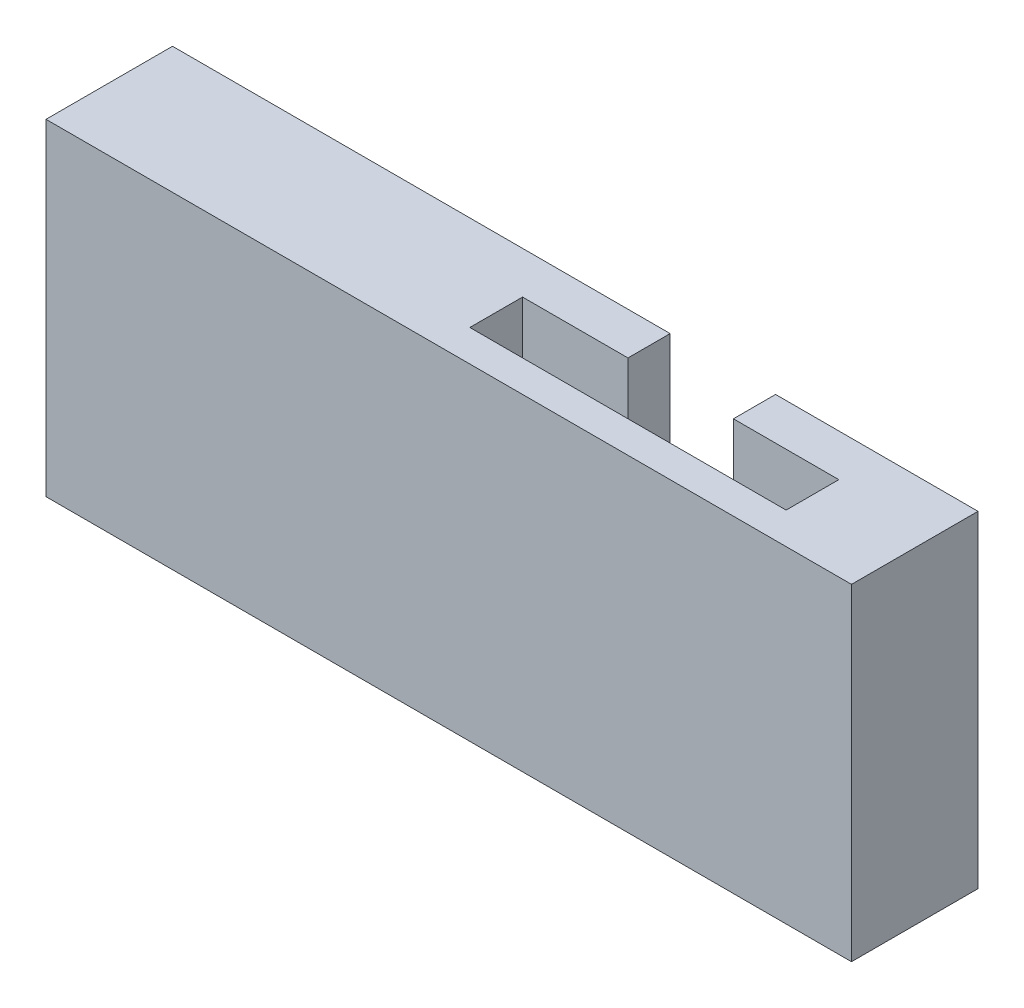
ISO-10303-21;
HEADER;
FILE_DESCRIPTION(('STEP AP214'),'2;1');
FILE_NAME('part.step','',(''),(''),'','','');
FILE_SCHEMA(('AUTOMOTIVE_DESIGN { 1 0 10303 214 1 1 1 1 }'));
ENDSEC;
DATA;
#1=APPLICATION_CONTEXT('core data for automotive mechanical design processes');
#2=APPLICATION_PROTOCOL_DEFINITION('international standard','automotive_design',2000,#1);
#3=PRODUCT_CONTEXT('',#1,'mechanical');
#4=PRODUCT('Part','Part','',(#3));
#5=PRODUCT_RELATED_PRODUCT_CATEGORY('part','',(#4));
#6=PRODUCT_DEFINITION_FORMATION('','',#4);
#7=PRODUCT_DEFINITION_CONTEXT('part definition',#1,'design');
#8=PRODUCT_DEFINITION('design','',#6,#7);
#9=PRODUCT_DEFINITION_SHAPE('','',#8);
#10=(LENGTH_UNIT() NAMED_UNIT(*) SI_UNIT(.MILLI.,.METRE.));
#11=(NAMED_UNIT(*) PLANE_ANGLE_UNIT() SI_UNIT($,.RADIAN.));
#12=(NAMED_UNIT(*) SI_UNIT($,.STERADIAN.) SOLID_ANGLE_UNIT());
#13=UNCERTAINTY_MEASURE_WITH_UNIT(LENGTH_MEASURE(1.E-05),#10,'distance_accuracy_value','');
#14=(GEOMETRIC_REPRESENTATION_CONTEXT(3) GLOBAL_UNCERTAINTY_ASSIGNED_CONTEXT((#13)) GLOBAL_UNIT_ASSIGNED_CONTEXT((#10,
#11,#12)) REPRESENTATION_CONTEXT('',''));
#15=CARTESIAN_POINT('',(0.,0.,0.));
#16=DIRECTION('',(0.,0.,1.));
#17=DIRECTION('',(1.,0.,0.));
#18=AXIS2_PLACEMENT_3D('',#15,#16,#17);
#19=CARTESIAN_POINT('',(0.,15.5,-6.));
#20=DIRECTION('',(0.,1.,0.));
#21=DIRECTION('',(0.,0.,-1.));
#22=AXIS2_PLACEMENT_3D('',#19,#20,#21);
#23=PLANE('',#22);
#24=DIRECTION('',(-1.,0.,0.));
#25=VECTOR('',#24,1.);
#26=CARTESIAN_POINT('',(0.,15.5,-6.));
#27=LINE('',#26,#25);
#28=CARTESIAN_POINT('',(38.6,15.5,-6.));
#29=VERTEX_POINT('',#28);
#30=CARTESIAN_POINT('',(0.4,15.5,-6.));
#31=VERTEX_POINT('',#30);
#32=EDGE_CURVE('E153',#29,#31,#27,.T.);
#33=ORIENTED_EDGE('',*,*,#32,.F.);
#34=DIRECTION('',(0.,0.,1.));
#35=VECTOR('',#34,1.);
#36=CARTESIAN_POINT('',(38.6,15.5,-6.));
#37=LINE('',#36,#35);
#38=CARTESIAN_POINT('',(38.6,15.5,-12.));
#39=VERTEX_POINT('',#38);
#40=EDGE_CURVE('E216',#39,#29,#37,.T.);
#41=ORIENTED_EDGE('',*,*,#40,.F.);
#42=DIRECTION('',(-1.,0.,0.));
#43=VECTOR('',#42,1.);
#44=CARTESIAN_POINT('',(0.,15.5,-12.));
#45=LINE('',#44,#43);
#46=CARTESIAN_POINT('',(29.,15.5,-12.));
#47=VERTEX_POINT('',#46);
#48=EDGE_CURVE('E146',#39,#47,#45,.T.);
#49=ORIENTED_EDGE('',*,*,#48,.T.);
#50=DIRECTION('',(0.,0.,1.));
#51=VECTOR('',#50,1.);
#52=CARTESIAN_POINT('',(29.,15.5,-10.));
#53=LINE('',#52,#51);
#54=CARTESIAN_POINT('',(29.,15.5,-10.));
#55=VERTEX_POINT('',#54);
#56=EDGE_CURVE('E196',#47,#55,#53,.T.);
#57=ORIENTED_EDGE('',*,*,#56,.T.);
#58=DIRECTION('',(1.,0.,0.));
#59=VECTOR('',#58,1.);
#60=CARTESIAN_POINT('',(34.,15.5,-10.));
#61=LINE('',#60,#59);
#62=CARTESIAN_POINT('',(34.,15.5,-10.));
#63=VERTEX_POINT('',#62);
#64=EDGE_CURVE('E199',#55,#63,#61,.T.);
#65=ORIENTED_EDGE('',*,*,#64,.T.);
#66=DIRECTION('',(0.,0.,1.));
#67=VECTOR('',#66,1.);
#68=CARTESIAN_POINT('',(34.,15.5,-7.5));
#69=LINE('',#68,#67);
#70=CARTESIAN_POINT('',(34.,15.5,-7.5));
#71=VERTEX_POINT('',#70);
#72=EDGE_CURVE('E203',#63,#71,#69,.T.);
#73=ORIENTED_EDGE('',*,*,#72,.T.);
#74=DIRECTION('',(-1.,0.,0.));
#75=VECTOR('',#74,1.);
#76=CARTESIAN_POINT('',(19.,15.5,-7.5));
#77=LINE('',#76,#75);
#78=CARTESIAN_POINT('',(19.,15.5,-7.5));
#79=VERTEX_POINT('',#78);
#80=EDGE_CURVE('E206',#71,#79,#77,.T.);
#81=ORIENTED_EDGE('',*,*,#80,.T.);
#82=DIRECTION('',(0.,0.,-1.));
#83=VECTOR('',#82,1.);
#84=CARTESIAN_POINT('',(19.,15.5,-10.));
#85=LINE('',#84,#83);
#86=CARTESIAN_POINT('',(19.,15.5,-10.));
#87=VERTEX_POINT('',#86);
#88=EDGE_CURVE('E209',#79,#87,#85,.T.);
#89=ORIENTED_EDGE('',*,*,#88,.T.);
#90=DIRECTION('',(1.,0.,0.));
#91=VECTOR('',#90,1.);
#92=CARTESIAN_POINT('',(24.,15.5,-10.));
#93=LINE('',#92,#91);
#94=CARTESIAN_POINT('',(24.,15.5,-10.));
#95=VERTEX_POINT('',#94);
#96=EDGE_CURVE('E212',#87,#95,#93,.T.);
#97=ORIENTED_EDGE('',*,*,#96,.T.);
#98=DIRECTION('',(0.,0.,-1.));
#99=VECTOR('',#98,1.);
#100=CARTESIAN_POINT('',(24.,15.5,-12.));
#101=LINE('',#100,#99);
#102=CARTESIAN_POINT('',(24.,15.5,-12.));
#103=VERTEX_POINT('',#102);
#104=EDGE_CURVE('E145',#95,#103,#101,.T.);
#105=ORIENTED_EDGE('',*,*,#104,.T.);
#106=CARTESIAN_POINT('',(0.4,15.5,-12.));
#107=VERTEX_POINT('',#106);
#108=EDGE_CURVE('E130',#103,#107,#45,.T.);
#109=ORIENTED_EDGE('',*,*,#108,.T.);
#110=DIRECTION('',(0.,0.,-1.));
#111=VECTOR('',#110,1.);
#112=CARTESIAN_POINT('',(0.4,15.5,-6.));
#113=LINE('',#112,#111);
#114=EDGE_CURVE('E135',#31,#107,#113,.T.);
#115=ORIENTED_EDGE('',*,*,#114,.F.);
#116=EDGE_LOOP('',(#33,#41,#49,#57,#65,#73,#81,#89,#97,#105,#109,#115));
#117=FACE_BOUND('',#116,.T.);
#118=ADVANCED_FACE('F39',(#117),#23,.T.);
#119=CARTESIAN_POINT('',(0.,0.,-6.));
#120=DIRECTION('',(0.,-1.,0.));
#121=DIRECTION('',(0.,0.,1.));
#122=AXIS2_PLACEMENT_3D('',#119,#120,#121);
#123=PLANE('',#122);
#124=DIRECTION('',(1.,0.,0.));
#125=VECTOR('',#124,1.);
#126=CARTESIAN_POINT('',(0.,0.,-12.));
#127=LINE('',#126,#125);
#128=CARTESIAN_POINT('',(0.4,0.,-12.));
#129=VERTEX_POINT('',#128);
#130=CARTESIAN_POINT('',(38.6,0.,-12.));
#131=VERTEX_POINT('',#130);
#132=EDGE_CURVE('E133',#129,#131,#127,.T.);
#133=ORIENTED_EDGE('',*,*,#132,.T.);
#134=DIRECTION('',(0.,0.,-1.));
#135=VECTOR('',#134,1.);
#136=CARTESIAN_POINT('',(38.6,0.,-6.));
#137=LINE('',#136,#135);
#138=CARTESIAN_POINT('',(38.6,0.,-6.));
#139=VERTEX_POINT('',#138);
#140=EDGE_CURVE('E218',#139,#131,#137,.T.);
#141=ORIENTED_EDGE('',*,*,#140,.F.);
#142=DIRECTION('',(1.,0.,0.));
#143=VECTOR('',#142,1.);
#144=CARTESIAN_POINT('',(0.,0.,-6.));
#145=LINE('',#144,#143);
#146=CARTESIAN_POINT('',(0.4,0.,-6.));
#147=VERTEX_POINT('',#146);
#148=EDGE_CURVE('E149',#147,#139,#145,.T.);
#149=ORIENTED_EDGE('',*,*,#148,.F.);
#150=DIRECTION('',(0.,0.,1.));
#151=VECTOR('',#150,1.);
#152=CARTESIAN_POINT('',(0.4,0.,-6.));
#153=LINE('',#152,#151);
#154=EDGE_CURVE('E141',#129,#147,#153,.T.);
#155=ORIENTED_EDGE('',*,*,#154,.F.);
#156=EDGE_LOOP('',(#133,#141,#149,#155));
#157=FACE_BOUND('',#156,.T.);
#158=ADVANCED_FACE('F41',(#157),#123,.T.);
#159=CARTESIAN_POINT('',(0.,0.,-6.));
#160=DIRECTION('',(0.,0.,1.));
#161=DIRECTION('',(-1.,0.,0.));
#162=AXIS2_PLACEMENT_3D('',#159,#160,#161);
#163=PLANE('',#162);
#164=ORIENTED_EDGE('',*,*,#148,.T.);
#165=DIRECTION('',(0.,-1.,0.));
#166=VECTOR('',#165,1.);
#167=CARTESIAN_POINT('',(38.6,0.,-6.));
#168=LINE('',#167,#166);
#169=EDGE_CURVE('E200',#29,#139,#168,.T.);
#170=ORIENTED_EDGE('',*,*,#169,.F.);
#171=ORIENTED_EDGE('',*,*,#32,.T.);
#172=DIRECTION('',(0.,1.,0.));
#173=VECTOR('',#172,1.);
#174=CARTESIAN_POINT('',(0.4,0.,-6.));
#175=LINE('',#174,#173);
#176=EDGE_CURVE('E137',#147,#31,#175,.T.);
#177=ORIENTED_EDGE('',*,*,#176,.F.);
#178=EDGE_LOOP('',(#164,#170,#171,#177));
#179=FACE_BOUND('',#178,.T.);
#180=ADVANCED_FACE('F224',(#179),#163,.T.);
#181=CARTESIAN_POINT('',(0.,0.,-12.));
#182=DIRECTION('',(0.,0.,1.));
#183=DIRECTION('',(-1.,0.,0.));
#184=AXIS2_PLACEMENT_3D('',#181,#182,#183);
#185=PLANE('',#184);
#186=DIRECTION('',(0.,1.,0.));
#187=VECTOR('',#186,1.);
#188=CARTESIAN_POINT('',(0.4,0.,-12.));
#189=LINE('',#188,#187);
#190=EDGE_CURVE('E12',#129,#107,#189,.T.);
#191=ORIENTED_EDGE('',*,*,#190,.T.);
#192=ORIENTED_EDGE('',*,*,#108,.F.);
#193=DIRECTION('',(0.,1.,0.));
#194=VECTOR('',#193,1.);
#195=CARTESIAN_POINT('',(24.,-15.6604597633658,-12.));
#196=LINE('',#195,#194);
#197=CARTESIAN_POINT('',(24.,3.,-12.));
#198=VERTEX_POINT('',#197);
#199=EDGE_CURVE('E179',#198,#103,#196,.T.);
#200=ORIENTED_EDGE('',*,*,#199,.F.);
#201=DIRECTION('',(1.,0.,0.));
#202=VECTOR('',#201,1.);
#203=CARTESIAN_POINT('',(29.,3.,-12.));
#204=LINE('',#203,#202);
#205=CARTESIAN_POINT('',(29.,3.,-12.));
#206=VERTEX_POINT('',#205);
#207=EDGE_CURVE('E159',#198,#206,#204,.T.);
#208=ORIENTED_EDGE('',*,*,#207,.T.);
#209=DIRECTION('',(0.,1.,0.));
#210=VECTOR('',#209,1.);
#211=CARTESIAN_POINT('',(29.,-15.6604597633658,-12.));
#212=LINE('',#211,#210);
#213=EDGE_CURVE('E150',#206,#47,#212,.T.);
#214=ORIENTED_EDGE('',*,*,#213,.T.);
#215=ORIENTED_EDGE('',*,*,#48,.F.);
#216=DIRECTION('',(0.,-1.,0.));
#217=VECTOR('',#216,1.);
#218=CARTESIAN_POINT('',(38.6,0.,-12.));
#219=LINE('',#218,#217);
#220=EDGE_CURVE('E47',#39,#131,#219,.T.);
#221=ORIENTED_EDGE('',*,*,#220,.T.);
#222=ORIENTED_EDGE('',*,*,#132,.F.);
#223=EDGE_LOOP('',(#191,#192,#200,#208,#214,#215,#221,#222));
#224=FACE_BOUND('',#223,.T.);
#225=ADVANCED_FACE('F127',(#224),#185,.F.);
#226=CARTESIAN_POINT('',(0.,3.,-6.));
#227=DIRECTION('',(0.,-1.,0.));
#228=DIRECTION('',(0.,0.,1.));
#229=AXIS2_PLACEMENT_3D('',#226,#227,#228);
#230=PLANE('',#229);
#231=ORIENTED_EDGE('',*,*,#207,.F.);
#232=DIRECTION('',(0.,0.,-1.));
#233=VECTOR('',#232,1.);
#234=CARTESIAN_POINT('',(24.,3.,-12.));
#235=LINE('',#234,#233);
#236=CARTESIAN_POINT('',(24.,3.,-10.));
#237=VERTEX_POINT('',#236);
#238=EDGE_CURVE('E178',#237,#198,#235,.T.);
#239=ORIENTED_EDGE('',*,*,#238,.F.);
#240=DIRECTION('',(1.,0.,0.));
#241=VECTOR('',#240,1.);
#242=CARTESIAN_POINT('',(24.,3.,-10.));
#243=LINE('',#242,#241);
#244=CARTESIAN_POINT('',(19.,3.,-10.));
#245=VERTEX_POINT('',#244);
#246=EDGE_CURVE('E175',#245,#237,#243,.T.);
#247=ORIENTED_EDGE('',*,*,#246,.F.);
#248=DIRECTION('',(0.,0.,-1.));
#249=VECTOR('',#248,1.);
#250=CARTESIAN_POINT('',(19.,3.,-10.));
#251=LINE('',#250,#249);
#252=CARTESIAN_POINT('',(19.,3.,-7.5));
#253=VERTEX_POINT('',#252);
#254=EDGE_CURVE('E172',#253,#245,#251,.T.);
#255=ORIENTED_EDGE('',*,*,#254,.F.);
#256=DIRECTION('',(-1.,0.,0.));
#257=VECTOR('',#256,1.);
#258=CARTESIAN_POINT('',(19.,3.,-7.5));
#259=LINE('',#258,#257);
#260=CARTESIAN_POINT('',(34.,3.,-7.5));
#261=VERTEX_POINT('',#260);
#262=EDGE_CURVE('E169',#261,#253,#259,.T.);
#263=ORIENTED_EDGE('',*,*,#262,.F.);
#264=DIRECTION('',(0.,0.,1.));
#265=VECTOR('',#264,1.);
#266=CARTESIAN_POINT('',(34.,3.,-7.5));
#267=LINE('',#266,#265);
#268=CARTESIAN_POINT('',(34.,3.,-10.));
#269=VERTEX_POINT('',#268);
#270=EDGE_CURVE('E166',#269,#261,#267,.T.);
#271=ORIENTED_EDGE('',*,*,#270,.F.);
#272=DIRECTION('',(1.,0.,0.));
#273=VECTOR('',#272,1.);
#274=CARTESIAN_POINT('',(34.,3.,-10.));
#275=LINE('',#274,#273);
#276=CARTESIAN_POINT('',(29.,3.,-10.));
#277=VERTEX_POINT('',#276);
#278=EDGE_CURVE('E162',#277,#269,#275,.T.);
#279=ORIENTED_EDGE('',*,*,#278,.F.);
#280=DIRECTION('',(0.,0.,1.));
#281=VECTOR('',#280,1.);
#282=CARTESIAN_POINT('',(29.,3.,-10.));
#283=LINE('',#282,#281);
#284=EDGE_CURVE('E163',#206,#277,#283,.T.);
#285=ORIENTED_EDGE('',*,*,#284,.F.);
#286=EDGE_LOOP('',(#231,#239,#247,#255,#263,#271,#279,#285));
#287=FACE_BOUND('',#286,.T.);
#288=ADVANCED_FACE('F256',(#287),#230,.F.);
#289=CARTESIAN_POINT('',(29.,-15.6604597633658,-10.));
#290=DIRECTION('',(1.,0.,0.));
#291=DIRECTION('',(0.,0.,1.));
#292=AXIS2_PLACEMENT_3D('',#289,#290,#291);
#293=PLANE('',#292);
#294=ORIENTED_EDGE('',*,*,#213,.F.);
#295=ORIENTED_EDGE('',*,*,#284,.T.);
#296=DIRECTION('',(0.,1.,0.));
#297=VECTOR('',#296,1.);
#298=CARTESIAN_POINT('',(29.,-15.6604597633658,-10.));
#299=LINE('',#298,#297);
#300=EDGE_CURVE('E160',#277,#55,#299,.T.);
#301=ORIENTED_EDGE('',*,*,#300,.T.);
#302=ORIENTED_EDGE('',*,*,#56,.F.);
#303=EDGE_LOOP('',(#294,#295,#301,#302));
#304=FACE_BOUND('',#303,.T.);
#305=ADVANCED_FACE('F231',(#304),#293,.F.);
#306=CARTESIAN_POINT('',(34.,-15.6604597633658,-10.));
#307=DIRECTION('',(0.,0.,-1.));
#308=DIRECTION('',(1.,0.,0.));
#309=AXIS2_PLACEMENT_3D('',#306,#307,#308);
#310=PLANE('',#309);
#311=ORIENTED_EDGE('',*,*,#300,.F.);
#312=ORIENTED_EDGE('',*,*,#278,.T.);
#313=DIRECTION('',(0.,1.,0.));
#314=VECTOR('',#313,1.);
#315=CARTESIAN_POINT('',(34.,-15.6604597633658,-10.));
#316=LINE('',#315,#314);
#317=EDGE_CURVE('E164',#269,#63,#316,.T.);
#318=ORIENTED_EDGE('',*,*,#317,.T.);
#319=ORIENTED_EDGE('',*,*,#64,.F.);
#320=EDGE_LOOP('',(#311,#312,#318,#319));
#321=FACE_BOUND('',#320,.T.);
#322=ADVANCED_FACE('F235',(#321),#310,.F.);
#323=CARTESIAN_POINT('',(34.,-15.6604597633658,-7.5));
#324=DIRECTION('',(1.,0.,0.));
#325=DIRECTION('',(0.,0.,1.));
#326=AXIS2_PLACEMENT_3D('',#323,#324,#325);
#327=PLANE('',#326);
#328=ORIENTED_EDGE('',*,*,#317,.F.);
#329=ORIENTED_EDGE('',*,*,#270,.T.);
#330=DIRECTION('',(0.,1.,0.));
#331=VECTOR('',#330,1.);
#332=CARTESIAN_POINT('',(34.,-15.6604597633658,-7.5));
#333=LINE('',#332,#331);
#334=EDGE_CURVE('E167',#261,#71,#333,.T.);
#335=ORIENTED_EDGE('',*,*,#334,.T.);
#336=ORIENTED_EDGE('',*,*,#72,.F.);
#337=EDGE_LOOP('',(#328,#329,#335,#336));
#338=FACE_BOUND('',#337,.T.);
#339=ADVANCED_FACE('F239',(#338),#327,.F.);
#340=CARTESIAN_POINT('',(19.,-15.6604597633658,-7.5));
#341=DIRECTION('',(0.,0.,1.));
#342=DIRECTION('',(-1.,0.,0.));
#343=AXIS2_PLACEMENT_3D('',#340,#341,#342);
#344=PLANE('',#343);
#345=ORIENTED_EDGE('',*,*,#334,.F.);
#346=ORIENTED_EDGE('',*,*,#262,.T.);
#347=DIRECTION('',(0.,1.,0.));
#348=VECTOR('',#347,1.);
#349=CARTESIAN_POINT('',(19.,-15.6604597633658,-7.5));
#350=LINE('',#349,#348);
#351=EDGE_CURVE('E170',#253,#79,#350,.T.);
#352=ORIENTED_EDGE('',*,*,#351,.T.);
#353=ORIENTED_EDGE('',*,*,#80,.F.);
#354=EDGE_LOOP('',(#345,#346,#352,#353));
#355=FACE_BOUND('',#354,.T.);
#356=ADVANCED_FACE('F243',(#355),#344,.F.);
#357=CARTESIAN_POINT('',(19.,-15.6604597633658,-10.));
#358=DIRECTION('',(-1.,0.,0.));
#359=DIRECTION('',(0.,0.,-1.));
#360=AXIS2_PLACEMENT_3D('',#357,#358,#359);
#361=PLANE('',#360);
#362=ORIENTED_EDGE('',*,*,#351,.F.);
#363=ORIENTED_EDGE('',*,*,#254,.T.);
#364=DIRECTION('',(0.,1.,0.));
#365=VECTOR('',#364,1.);
#366=CARTESIAN_POINT('',(19.,-15.6604597633658,-10.));
#367=LINE('',#366,#365);
#368=EDGE_CURVE('E173',#245,#87,#367,.T.);
#369=ORIENTED_EDGE('',*,*,#368,.T.);
#370=ORIENTED_EDGE('',*,*,#88,.F.);
#371=EDGE_LOOP('',(#362,#363,#369,#370));
#372=FACE_BOUND('',#371,.T.);
#373=ADVANCED_FACE('F247',(#372),#361,.F.);
#374=CARTESIAN_POINT('',(24.,-15.6604597633658,-10.));
#375=DIRECTION('',(0.,0.,-1.));
#376=DIRECTION('',(1.,0.,0.));
#377=AXIS2_PLACEMENT_3D('',#374,#375,#376);
#378=PLANE('',#377);
#379=ORIENTED_EDGE('',*,*,#368,.F.);
#380=ORIENTED_EDGE('',*,*,#246,.T.);
#381=DIRECTION('',(0.,1.,0.));
#382=VECTOR('',#381,1.);
#383=CARTESIAN_POINT('',(24.,-15.6604597633658,-10.));
#384=LINE('',#383,#382);
#385=EDGE_CURVE('E176',#237,#95,#384,.T.);
#386=ORIENTED_EDGE('',*,*,#385,.T.);
#387=ORIENTED_EDGE('',*,*,#96,.F.);
#388=EDGE_LOOP('',(#379,#380,#386,#387));
#389=FACE_BOUND('',#388,.T.);
#390=ADVANCED_FACE('F250',(#389),#378,.F.);
#391=CARTESIAN_POINT('',(24.,-15.6604597633658,-12.));
#392=DIRECTION('',(-1.,0.,0.));
#393=DIRECTION('',(0.,0.,-1.));
#394=AXIS2_PLACEMENT_3D('',#391,#392,#393);
#395=PLANE('',#394);
#396=ORIENTED_EDGE('',*,*,#385,.F.);
#397=ORIENTED_EDGE('',*,*,#238,.T.);
#398=ORIENTED_EDGE('',*,*,#199,.T.);
#399=ORIENTED_EDGE('',*,*,#104,.F.);
#400=EDGE_LOOP('',(#396,#397,#398,#399));
#401=FACE_BOUND('',#400,.T.);
#402=ADVANCED_FACE('F254',(#401),#395,.F.);
#403=CARTESIAN_POINT('',(38.6,0.,-12.));
#404=DIRECTION('',(1.,0.,0.));
#405=DIRECTION('',(0.,0.,1.));
#406=AXIS2_PLACEMENT_3D('',#403,#404,#405);
#407=PLANE('',#406);
#408=ORIENTED_EDGE('',*,*,#40,.T.);
#409=ORIENTED_EDGE('',*,*,#169,.T.);
#410=ORIENTED_EDGE('',*,*,#140,.T.);
#411=ORIENTED_EDGE('',*,*,#220,.F.);
#412=EDGE_LOOP('',(#408,#409,#410,#411));
#413=FACE_BOUND('',#412,.T.);
#414=ADVANCED_FACE('F226',(#413),#407,.T.);
#415=CARTESIAN_POINT('',(0.4,0.,-12.));
#416=DIRECTION('',(-1.,0.,0.));
#417=DIRECTION('',(0.,0.,-1.));
#418=AXIS2_PLACEMENT_3D('',#415,#416,#417);
#419=PLANE('',#418);
#420=ORIENTED_EDGE('',*,*,#154,.T.);
#421=ORIENTED_EDGE('',*,*,#176,.T.);
#422=ORIENTED_EDGE('',*,*,#114,.T.);
#423=ORIENTED_EDGE('',*,*,#190,.F.);
#424=EDGE_LOOP('',(#420,#421,#422,#423));
#425=FACE_BOUND('',#424,.T.);
#426=ADVANCED_FACE('F136',(#425),#419,.T.);
#427=CLOSED_SHELL('',(#118,#158,#180,#225,#288,#305,#322,#339,#356,#373,#390,#402,#414,#426));
#428=MANIFOLD_SOLID_BREP('B2',#427);
#429=ADVANCED_BREP_SHAPE_REPRESENTATION('',(#18,#428),#14);
#430=SHAPE_DEFINITION_REPRESENTATION(#9,#429);
ENDSEC;
END-ISO-10303-21;
